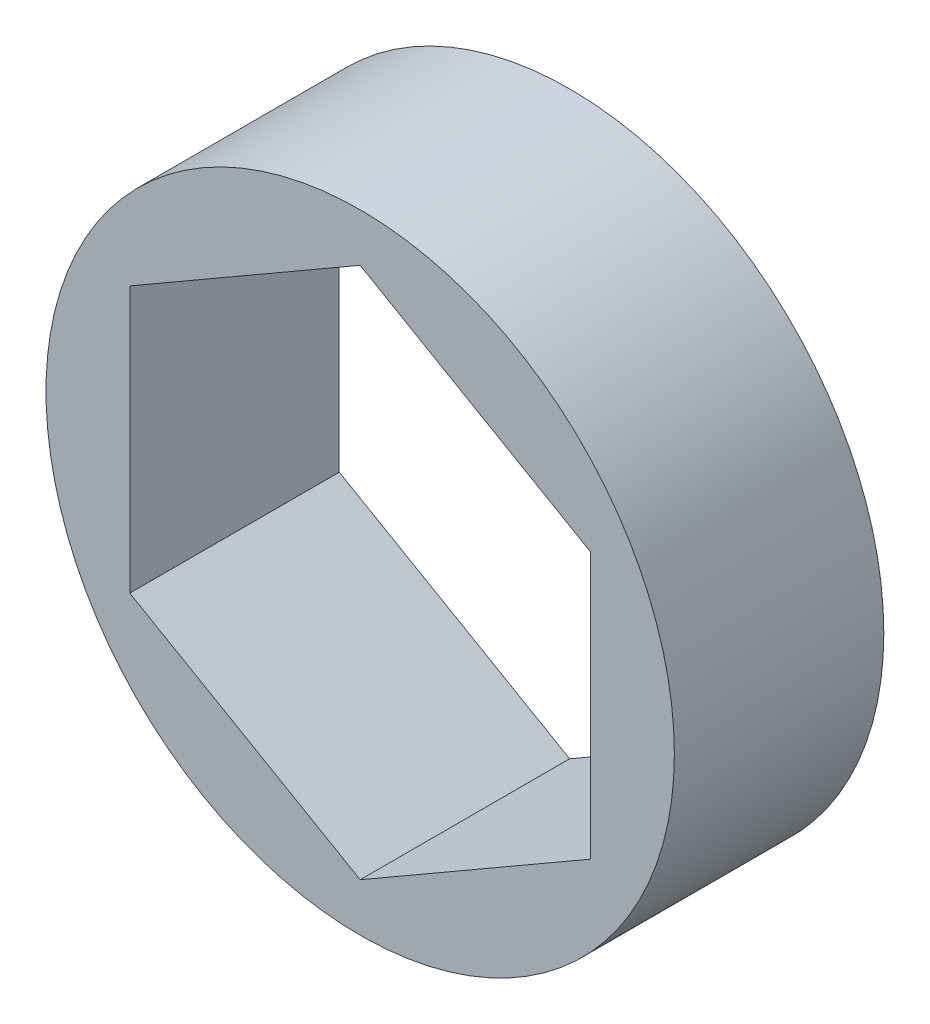
ISO-10303-21;
HEADER;
FILE_DESCRIPTION(('STEP AP214'),'2;1');
FILE_NAME('part.step','',(''),(''),'','','');
FILE_SCHEMA(('AUTOMOTIVE_DESIGN { 1 0 10303 214 1 1 1 1 }'));
ENDSEC;
DATA;
#1=APPLICATION_CONTEXT('core data for automotive mechanical design processes');
#2=APPLICATION_PROTOCOL_DEFINITION('international standard','automotive_design',2000,#1);
#3=PRODUCT_CONTEXT('',#1,'mechanical');
#4=PRODUCT('Part','Part','',(#3));
#5=PRODUCT_RELATED_PRODUCT_CATEGORY('part','',(#4));
#6=PRODUCT_DEFINITION_FORMATION('','',#4);
#7=PRODUCT_DEFINITION_CONTEXT('part definition',#1,'design');
#8=PRODUCT_DEFINITION('design','',#6,#7);
#9=PRODUCT_DEFINITION_SHAPE('','',#8);
#10=(LENGTH_UNIT() NAMED_UNIT(*) SI_UNIT(.MILLI.,.METRE.));
#11=(NAMED_UNIT(*) PLANE_ANGLE_UNIT() SI_UNIT($,.RADIAN.));
#12=(NAMED_UNIT(*) SI_UNIT($,.STERADIAN.) SOLID_ANGLE_UNIT());
#13=UNCERTAINTY_MEASURE_WITH_UNIT(LENGTH_MEASURE(1.E-05),#10,'distance_accuracy_value','');
#14=(GEOMETRIC_REPRESENTATION_CONTEXT(3) GLOBAL_UNCERTAINTY_ASSIGNED_CONTEXT((#13)) GLOBAL_UNIT_ASSIGNED_CONTEXT((#10,
#11,#12)) REPRESENTATION_CONTEXT('',''));
#15=CARTESIAN_POINT('',(0.,0.,0.));
#16=DIRECTION('',(0.,0.,1.));
#17=DIRECTION('',(1.,0.,0.));
#18=AXIS2_PLACEMENT_3D('',#15,#16,#17);
#19=CARTESIAN_POINT('',(0.,0.,3.175));
#20=DIRECTION('',(0.,0.,1.));
#21=DIRECTION('',(1.,0.,0.));
#22=AXIS2_PLACEMENT_3D('',#19,#20,#21);
#23=PLANE('',#22);
#24=CARTESIAN_POINT('',(0.,0.,3.175));
#25=DIRECTION('',(0.,0.,1.));
#26=DIRECTION('',(1.,0.,0.));
#27=AXIS2_PLACEMENT_3D('',#24,#25,#26);
#28=CIRCLE('',#27,9.525);
#29=CARTESIAN_POINT('',(9.525,0.,3.175));
#30=VERTEX_POINT('',#29);
#31=EDGE_CURVE('E11',#30,#30,#28,.T.);
#32=ORIENTED_EDGE('',*,*,#31,.T.);
#33=EDGE_LOOP('',(#32));
#34=FACE_BOUND('',#33,.T.);
#35=DIRECTION('',(-0.866025403784438,-0.5,0.));
#36=VECTOR('',#35,1.);
#37=CARTESIAN_POINT('',(0.,8.06558326057907,3.175));
#38=LINE('',#37,#36);
#39=CARTESIAN_POINT('',(0.,8.06558326057907,3.175));
#40=VERTEX_POINT('',#39);
#41=CARTESIAN_POINT('',(-6.985,4.03279163028954,3.175));
#42=VERTEX_POINT('',#41);
#43=EDGE_CURVE('E98',#40,#42,#38,.T.);
#44=ORIENTED_EDGE('',*,*,#43,.F.);
#45=DIRECTION('',(-0.866025403784439,0.5,0.));
#46=VECTOR('',#45,1.);
#47=CARTESIAN_POINT('',(6.985,4.03279163028954,3.175));
#48=LINE('',#47,#46);
#49=CARTESIAN_POINT('',(6.985,4.03279163028954,3.175));
#50=VERTEX_POINT('',#49);
#51=EDGE_CURVE('E90',#50,#40,#48,.T.);
#52=ORIENTED_EDGE('',*,*,#51,.F.);
#53=DIRECTION('',(0.,1.,0.));
#54=VECTOR('',#53,1.);
#55=CARTESIAN_POINT('',(6.985,-4.03279163028954,3.175));
#56=LINE('',#55,#54);
#57=CARTESIAN_POINT('',(6.985,-4.03279163028954,3.175));
#58=VERTEX_POINT('',#57);
#59=EDGE_CURVE('E118',#58,#50,#56,.T.);
#60=ORIENTED_EDGE('',*,*,#59,.F.);
#61=DIRECTION('',(0.866025403784439,0.5,0.));
#62=VECTOR('',#61,1.);
#63=CARTESIAN_POINT('',(0.,-8.06558326057907,3.175));
#64=LINE('',#63,#62);
#65=CARTESIAN_POINT('',(0.,-8.06558326057907,3.175));
#66=VERTEX_POINT('',#65);
#67=EDGE_CURVE('E116',#66,#58,#64,.T.);
#68=ORIENTED_EDGE('',*,*,#67,.F.);
#69=DIRECTION('',(0.866025403784438,-0.5,0.));
#70=VECTOR('',#69,1.);
#71=CARTESIAN_POINT('',(-6.985,-4.03279163028953,3.175));
#72=LINE('',#71,#70);
#73=CARTESIAN_POINT('',(-6.985,-4.03279163028953,3.175));
#74=VERTEX_POINT('',#73);
#75=EDGE_CURVE('E112',#74,#66,#72,.T.);
#76=ORIENTED_EDGE('',*,*,#75,.F.);
#77=DIRECTION('',(0.,-1.,0.));
#78=VECTOR('',#77,1.);
#79=CARTESIAN_POINT('',(-6.985,4.03279163028954,3.175));
#80=LINE('',#79,#78);
#81=EDGE_CURVE('E110',#42,#74,#80,.T.);
#82=ORIENTED_EDGE('',*,*,#81,.F.);
#83=EDGE_LOOP('',(#44,#52,#60,#68,#76,#82));
#84=FACE_BOUND('',#83,.T.);
#85=ADVANCED_FACE('F37',(#34,#84),#23,.T.);
#86=CARTESIAN_POINT('',(0.,0.,-3.175));
#87=DIRECTION('',(0.,0.,1.));
#88=DIRECTION('',(1.,0.,0.));
#89=AXIS2_PLACEMENT_3D('',#86,#87,#88);
#90=PLANE('',#89);
#91=CARTESIAN_POINT('',(0.,0.,-3.175));
#92=DIRECTION('',(0.,0.,1.));
#93=DIRECTION('',(1.,0.,0.));
#94=AXIS2_PLACEMENT_3D('',#91,#92,#93);
#95=CIRCLE('',#94,9.525);
#96=CARTESIAN_POINT('',(9.525,0.,-3.175));
#97=VERTEX_POINT('',#96);
#98=EDGE_CURVE('E41',#97,#97,#95,.T.);
#99=ORIENTED_EDGE('',*,*,#98,.F.);
#100=EDGE_LOOP('',(#99));
#101=FACE_BOUND('',#100,.T.);
#102=DIRECTION('',(-0.866025403784439,0.5,0.));
#103=VECTOR('',#102,1.);
#104=CARTESIAN_POINT('',(6.985,4.03279163028954,-3.175));
#105=LINE('',#104,#103);
#106=CARTESIAN_POINT('',(6.985,4.03279163028954,-3.175));
#107=VERTEX_POINT('',#106);
#108=CARTESIAN_POINT('',(0.,8.06558326057907,-3.175));
#109=VERTEX_POINT('',#108);
#110=EDGE_CURVE('E60',#107,#109,#105,.T.);
#111=ORIENTED_EDGE('',*,*,#110,.T.);
#112=DIRECTION('',(-0.866025403784438,-0.5,0.));
#113=VECTOR('',#112,1.);
#114=CARTESIAN_POINT('',(0.,8.06558326057907,-3.175));
#115=LINE('',#114,#113);
#116=CARTESIAN_POINT('',(-6.985,4.03279163028954,-3.175));
#117=VERTEX_POINT('',#116);
#118=EDGE_CURVE('E105',#109,#117,#115,.T.);
#119=ORIENTED_EDGE('',*,*,#118,.T.);
#120=DIRECTION('',(0.,-1.,0.));
#121=VECTOR('',#120,1.);
#122=CARTESIAN_POINT('',(-6.985,4.03279163028954,-3.175));
#123=LINE('',#122,#121);
#124=CARTESIAN_POINT('',(-6.985,-4.03279163028953,-3.175));
#125=VERTEX_POINT('',#124);
#126=EDGE_CURVE('E122',#117,#125,#123,.T.);
#127=ORIENTED_EDGE('',*,*,#126,.T.);
#128=DIRECTION('',(0.866025403784438,-0.5,0.));
#129=VECTOR('',#128,1.);
#130=CARTESIAN_POINT('',(-6.985,-4.03279163028953,-3.175));
#131=LINE('',#130,#129);
#132=CARTESIAN_POINT('',(0.,-8.06558326057907,-3.175));
#133=VERTEX_POINT('',#132);
#134=EDGE_CURVE('E125',#125,#133,#131,.T.);
#135=ORIENTED_EDGE('',*,*,#134,.T.);
#136=DIRECTION('',(0.866025403784439,0.5,0.));
#137=VECTOR('',#136,1.);
#138=CARTESIAN_POINT('',(0.,-8.06558326057907,-3.175));
#139=LINE('',#138,#137);
#140=CARTESIAN_POINT('',(6.985,-4.03279163028954,-3.175));
#141=VERTEX_POINT('',#140);
#142=EDGE_CURVE('E128',#133,#141,#139,.T.);
#143=ORIENTED_EDGE('',*,*,#142,.T.);
#144=DIRECTION('',(0.,1.,0.));
#145=VECTOR('',#144,1.);
#146=CARTESIAN_POINT('',(6.985,-4.03279163028954,-3.175));
#147=LINE('',#146,#145);
#148=EDGE_CURVE('E99',#141,#107,#147,.T.);
#149=ORIENTED_EDGE('',*,*,#148,.T.);
#150=EDGE_LOOP('',(#111,#119,#127,#135,#143,#149));
#151=FACE_BOUND('',#150,.T.);
#152=ADVANCED_FACE('F145',(#101,#151),#90,.F.);
#153=CARTESIAN_POINT('',(0.,0.,3.175));
#154=DIRECTION('',(0.,0.,-1.));
#155=DIRECTION('',(-1.,0.,0.));
#156=AXIS2_PLACEMENT_3D('',#153,#154,#155);
#157=CYLINDRICAL_SURFACE('',#156,9.525);
#158=ORIENTED_EDGE('',*,*,#31,.F.);
#159=EDGE_LOOP('',(#158));
#160=FACE_BOUND('',#159,.T.);
#161=ORIENTED_EDGE('',*,*,#98,.T.);
#162=EDGE_LOOP('',(#161));
#163=FACE_BOUND('',#162,.T.);
#164=ADVANCED_FACE('F39',(#160,#163),#157,.T.);
#165=CARTESIAN_POINT('',(6.985,4.03279163028954,3.175));
#166=DIRECTION('',(-0.5,-0.866025403784439,0.));
#167=DIRECTION('',(0.866025403784439,-0.5,0.));
#168=AXIS2_PLACEMENT_3D('',#165,#166,#167);
#169=PLANE('',#168);
#170=ORIENTED_EDGE('',*,*,#110,.F.);
#171=DIRECTION('',(0.,0.,-1.));
#172=VECTOR('',#171,1.);
#173=CARTESIAN_POINT('',(6.985,4.03279163028954,3.175));
#174=LINE('',#173,#172);
#175=EDGE_CURVE('E94',#50,#107,#174,.T.);
#176=ORIENTED_EDGE('',*,*,#175,.F.);
#177=ORIENTED_EDGE('',*,*,#51,.T.);
#178=DIRECTION('',(0.,0.,-1.));
#179=VECTOR('',#178,1.);
#180=CARTESIAN_POINT('',(0.,8.06558326057907,3.175));
#181=LINE('',#180,#179);
#182=EDGE_CURVE('E93',#40,#109,#181,.T.);
#183=ORIENTED_EDGE('',*,*,#182,.T.);
#184=EDGE_LOOP('',(#170,#176,#177,#183));
#185=FACE_BOUND('',#184,.T.);
#186=ADVANCED_FACE('F92',(#185),#169,.T.);
#187=CARTESIAN_POINT('',(0.,8.06558326057907,3.175));
#188=DIRECTION('',(0.5,-0.866025403784439,0.));
#189=DIRECTION('',(0.866025403784439,0.5,0.));
#190=AXIS2_PLACEMENT_3D('',#187,#188,#189);
#191=PLANE('',#190);
#192=ORIENTED_EDGE('',*,*,#118,.F.);
#193=ORIENTED_EDGE('',*,*,#182,.F.);
#194=ORIENTED_EDGE('',*,*,#43,.T.);
#195=DIRECTION('',(0.,0.,-1.));
#196=VECTOR('',#195,1.);
#197=CARTESIAN_POINT('',(-6.985,4.03279163028954,3.175));
#198=LINE('',#197,#196);
#199=EDGE_CURVE('E106',#42,#117,#198,.T.);
#200=ORIENTED_EDGE('',*,*,#199,.T.);
#201=EDGE_LOOP('',(#192,#193,#194,#200));
#202=FACE_BOUND('',#201,.T.);
#203=ADVANCED_FACE('F102',(#202),#191,.T.);
#204=CARTESIAN_POINT('',(-6.985,4.03279163028954,3.175));
#205=DIRECTION('',(1.,0.,0.));
#206=DIRECTION('',(0.,1.,0.));
#207=AXIS2_PLACEMENT_3D('',#204,#205,#206);
#208=PLANE('',#207);
#209=ORIENTED_EDGE('',*,*,#126,.F.);
#210=ORIENTED_EDGE('',*,*,#199,.F.);
#211=ORIENTED_EDGE('',*,*,#81,.T.);
#212=DIRECTION('',(0.,0.,-1.));
#213=VECTOR('',#212,1.);
#214=CARTESIAN_POINT('',(-6.985,-4.03279163028953,3.175));
#215=LINE('',#214,#213);
#216=EDGE_CURVE('E137',#74,#125,#215,.T.);
#217=ORIENTED_EDGE('',*,*,#216,.T.);
#218=EDGE_LOOP('',(#209,#210,#211,#217));
#219=FACE_BOUND('',#218,.T.);
#220=ADVANCED_FACE('F141',(#219),#208,.T.);
#221=CARTESIAN_POINT('',(-6.985,-4.03279163028953,3.175));
#222=DIRECTION('',(0.5,0.866025403784438,0.));
#223=DIRECTION('',(-0.866025403784439,0.5,0.));
#224=AXIS2_PLACEMENT_3D('',#221,#222,#223);
#225=PLANE('',#224);
#226=ORIENTED_EDGE('',*,*,#134,.F.);
#227=ORIENTED_EDGE('',*,*,#216,.F.);
#228=ORIENTED_EDGE('',*,*,#75,.T.);
#229=DIRECTION('',(0.,0.,-1.));
#230=VECTOR('',#229,1.);
#231=CARTESIAN_POINT('',(0.,-8.06558326057907,3.175));
#232=LINE('',#231,#230);
#233=EDGE_CURVE('E135',#66,#133,#232,.T.);
#234=ORIENTED_EDGE('',*,*,#233,.T.);
#235=EDGE_LOOP('',(#226,#227,#228,#234));
#236=FACE_BOUND('',#235,.T.);
#237=ADVANCED_FACE('F153',(#236),#225,.T.);
#238=CARTESIAN_POINT('',(0.,-8.06558326057907,3.175));
#239=DIRECTION('',(-0.5,0.866025403784439,0.));
#240=DIRECTION('',(-0.866025403784439,-0.5,0.));
#241=AXIS2_PLACEMENT_3D('',#238,#239,#240);
#242=PLANE('',#241);
#243=ORIENTED_EDGE('',*,*,#142,.F.);
#244=ORIENTED_EDGE('',*,*,#233,.F.);
#245=ORIENTED_EDGE('',*,*,#67,.T.);
#246=DIRECTION('',(0.,0.,-1.));
#247=VECTOR('',#246,1.);
#248=CARTESIAN_POINT('',(6.985,-4.03279163028954,3.175));
#249=LINE('',#248,#247);
#250=EDGE_CURVE('E52',#58,#141,#249,.T.);
#251=ORIENTED_EDGE('',*,*,#250,.T.);
#252=EDGE_LOOP('',(#243,#244,#245,#251));
#253=FACE_BOUND('',#252,.T.);
#254=ADVANCED_FACE('F151',(#253),#242,.T.);
#255=CARTESIAN_POINT('',(6.985,-4.03279163028954,3.175));
#256=DIRECTION('',(-1.,0.,0.));
#257=DIRECTION('',(0.,-1.,0.));
#258=AXIS2_PLACEMENT_3D('',#255,#256,#257);
#259=PLANE('',#258);
#260=ORIENTED_EDGE('',*,*,#148,.F.);
#261=ORIENTED_EDGE('',*,*,#250,.F.);
#262=ORIENTED_EDGE('',*,*,#59,.T.);
#263=ORIENTED_EDGE('',*,*,#175,.T.);
#264=EDGE_LOOP('',(#260,#261,#262,#263));
#265=FACE_BOUND('',#264,.T.);
#266=ADVANCED_FACE('F147',(#265),#259,.T.);
#267=CLOSED_SHELL('',(#85,#152,#164,#186,#203,#220,#237,#254,#266));
#268=MANIFOLD_SOLID_BREP('B2',#267);
#269=ADVANCED_BREP_SHAPE_REPRESENTATION('',(#18,#268),#14);
#270=SHAPE_DEFINITION_REPRESENTATION(#9,#269);
ENDSEC;
END-ISO-10303-21;
